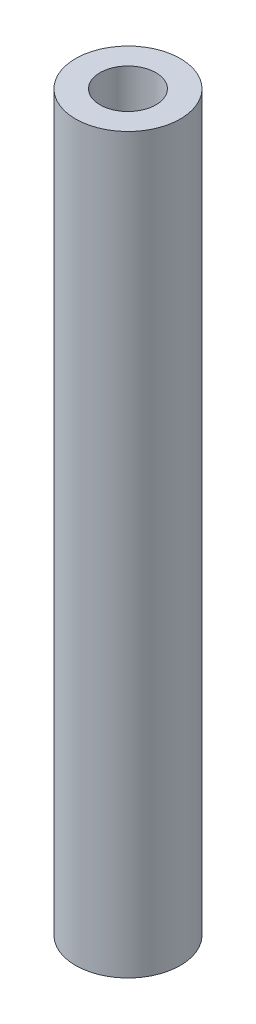
ISO-10303-21;
HEADER;
FILE_DESCRIPTION(('STEP AP214'),'2;1');
FILE_NAME('part.step','',(''),(''),'','','');
FILE_SCHEMA(('AUTOMOTIVE_DESIGN { 1 0 10303 214 1 1 1 1 }'));
ENDSEC;
DATA;
#1=APPLICATION_CONTEXT('core data for automotive mechanical design processes');
#2=APPLICATION_PROTOCOL_DEFINITION('international standard','automotive_design',2000,#1);
#3=PRODUCT_CONTEXT('',#1,'mechanical');
#4=PRODUCT('Part','Part','',(#3));
#5=PRODUCT_RELATED_PRODUCT_CATEGORY('part','',(#4));
#6=PRODUCT_DEFINITION_FORMATION('','',#4);
#7=PRODUCT_DEFINITION_CONTEXT('part definition',#1,'design');
#8=PRODUCT_DEFINITION('design','',#6,#7);
#9=PRODUCT_DEFINITION_SHAPE('','',#8);
#10=(LENGTH_UNIT() NAMED_UNIT(*) SI_UNIT(.MILLI.,.METRE.));
#11=(NAMED_UNIT(*) PLANE_ANGLE_UNIT() SI_UNIT($,.RADIAN.));
#12=(NAMED_UNIT(*) SI_UNIT($,.STERADIAN.) SOLID_ANGLE_UNIT());
#13=UNCERTAINTY_MEASURE_WITH_UNIT(LENGTH_MEASURE(1.E-05),#10,'distance_accuracy_value','');
#14=(GEOMETRIC_REPRESENTATION_CONTEXT(3) GLOBAL_UNCERTAINTY_ASSIGNED_CONTEXT((#13)) GLOBAL_UNIT_ASSIGNED_CONTEXT((#10,
#11,#12)) REPRESENTATION_CONTEXT('',''));
#15=CARTESIAN_POINT('',(0.,0.,0.));
#16=DIRECTION('',(0.,0.,1.));
#17=DIRECTION('',(1.,0.,0.));
#18=AXIS2_PLACEMENT_3D('',#15,#16,#17);
#19=CARTESIAN_POINT('',(0.,66.675,0.));
#20=DIRECTION('',(0.,1.,0.));
#21=DIRECTION('',(0.,0.,1.));
#22=AXIS2_PLACEMENT_3D('',#19,#20,#21);
#23=PLANE('',#22);
#24=CARTESIAN_POINT('',(0.,66.675,0.));
#25=DIRECTION('',(0.,1.,0.));
#26=DIRECTION('',(0.,0.,1.));
#27=AXIS2_PLACEMENT_3D('',#24,#25,#26);
#28=CIRCLE('',#27,4.7625);
#29=CARTESIAN_POINT('',(0.,66.675,4.7625));
#30=VERTEX_POINT('',#29);
#31=EDGE_CURVE('E10',#30,#30,#28,.T.);
#32=ORIENTED_EDGE('',*,*,#31,.T.);
#33=EDGE_LOOP('',(#32));
#34=FACE_BOUND('',#33,.T.);
#35=CARTESIAN_POINT('',(0.,66.675,0.));
#36=DIRECTION('',(0.,1.,0.));
#37=DIRECTION('',(0.,0.,1.));
#38=AXIS2_PLACEMENT_3D('',#35,#36,#37);
#39=CIRCLE('',#38,2.54);
#40=CARTESIAN_POINT('',(0.,66.675,2.54));
#41=VERTEX_POINT('',#40);
#42=EDGE_CURVE('E44',#41,#41,#39,.T.);
#43=ORIENTED_EDGE('',*,*,#42,.F.);
#44=EDGE_LOOP('',(#43));
#45=FACE_BOUND('',#44,.T.);
#46=ADVANCED_FACE('F33',(#34,#45),#23,.T.);
#47=CARTESIAN_POINT('',(0.,0.,0.));
#48=DIRECTION('',(0.,1.,0.));
#49=DIRECTION('',(0.,0.,1.));
#50=AXIS2_PLACEMENT_3D('',#47,#48,#49);
#51=PLANE('',#50);
#52=CARTESIAN_POINT('',(0.,0.,0.));
#53=DIRECTION('',(0.,1.,0.));
#54=DIRECTION('',(0.,0.,1.));
#55=AXIS2_PLACEMENT_3D('',#52,#53,#54);
#56=CIRCLE('',#55,4.7625);
#57=CARTESIAN_POINT('',(0.,0.,4.7625));
#58=VERTEX_POINT('',#57);
#59=EDGE_CURVE('E37',#58,#58,#56,.T.);
#60=ORIENTED_EDGE('',*,*,#59,.F.);
#61=EDGE_LOOP('',(#60));
#62=FACE_BOUND('',#61,.T.);
#63=CARTESIAN_POINT('',(0.,0.,0.));
#64=DIRECTION('',(0.,1.,0.));
#65=DIRECTION('',(0.,0.,1.));
#66=AXIS2_PLACEMENT_3D('',#63,#64,#65);
#67=CIRCLE('',#66,2.54);
#68=CARTESIAN_POINT('',(0.,0.,2.54));
#69=VERTEX_POINT('',#68);
#70=EDGE_CURVE('E46',#69,#69,#67,.T.);
#71=ORIENTED_EDGE('',*,*,#70,.T.);
#72=EDGE_LOOP('',(#71));
#73=FACE_BOUND('',#72,.T.);
#74=ADVANCED_FACE('F56',(#62,#73),#51,.F.);
#75=CARTESIAN_POINT('',(0.,66.675,0.));
#76=DIRECTION('',(0.,-1.,0.));
#77=DIRECTION('',(0.,0.,-1.));
#78=AXIS2_PLACEMENT_3D('',#75,#76,#77);
#79=CYLINDRICAL_SURFACE('',#78,4.7625);
#80=ORIENTED_EDGE('',*,*,#31,.F.);
#81=EDGE_LOOP('',(#80));
#82=FACE_BOUND('',#81,.T.);
#83=ORIENTED_EDGE('',*,*,#59,.T.);
#84=EDGE_LOOP('',(#83));
#85=FACE_BOUND('',#84,.T.);
#86=ADVANCED_FACE('F35',(#82,#85),#79,.T.);
#87=CARTESIAN_POINT('',(0.,66.675,0.));
#88=DIRECTION('',(0.,-1.,0.));
#89=DIRECTION('',(0.,0.,-1.));
#90=AXIS2_PLACEMENT_3D('',#87,#88,#89);
#91=CYLINDRICAL_SURFACE('',#90,2.54);
#92=ORIENTED_EDGE('',*,*,#42,.T.);
#93=EDGE_LOOP('',(#92));
#94=FACE_BOUND('',#93,.T.);
#95=ORIENTED_EDGE('',*,*,#70,.F.);
#96=EDGE_LOOP('',(#95));
#97=FACE_BOUND('',#96,.T.);
#98=ADVANCED_FACE('F52',(#94,#97),#91,.F.);
#99=CLOSED_SHELL('',(#46,#74,#86,#98));
#100=MANIFOLD_SOLID_BREP('B2',#99);
#101=ADVANCED_BREP_SHAPE_REPRESENTATION('',(#18,#100),#14);
#102=SHAPE_DEFINITION_REPRESENTATION(#9,#101);
ENDSEC;
END-ISO-10303-21;
